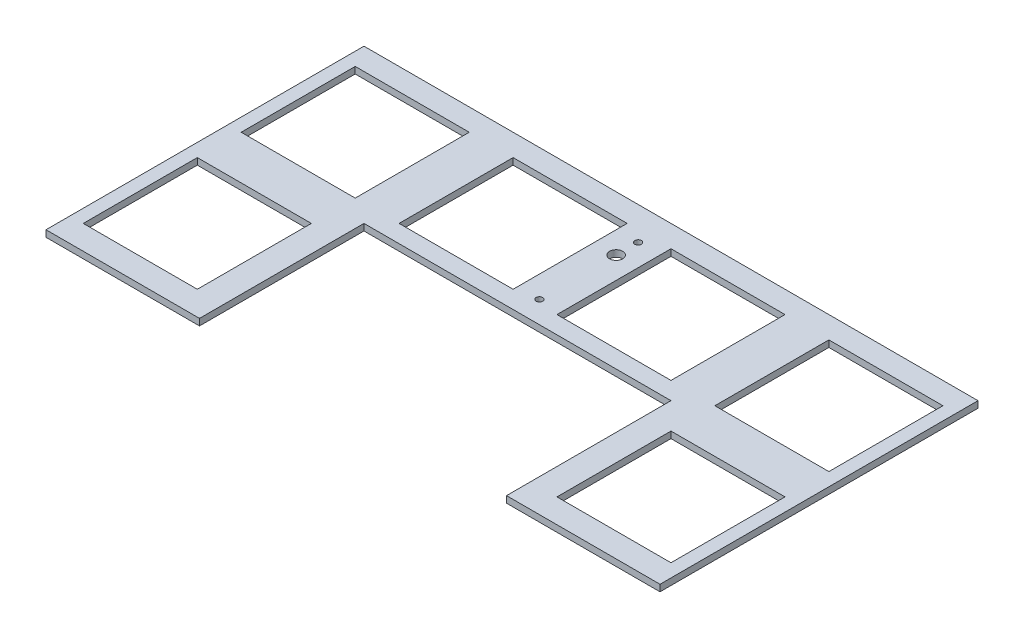
ISO-10303-21;
HEADER;
FILE_DESCRIPTION(('STEP AP214'),'2;1');
FILE_NAME('part.step','',(''),(''),'','','');
FILE_SCHEMA(('AUTOMOTIVE_DESIGN { 1 0 10303 214 1 1 1 1 }'));
ENDSEC;
DATA;
#1=APPLICATION_CONTEXT('core data for automotive mechanical design processes');
#2=APPLICATION_PROTOCOL_DEFINITION('international standard','automotive_design',2000,#1);
#3=PRODUCT_CONTEXT('',#1,'mechanical');
#4=PRODUCT('Part','Part','',(#3));
#5=PRODUCT_RELATED_PRODUCT_CATEGORY('part','',(#4));
#6=PRODUCT_DEFINITION_FORMATION('','',#4);
#7=PRODUCT_DEFINITION_CONTEXT('part definition',#1,'design');
#8=PRODUCT_DEFINITION('design','',#6,#7);
#9=PRODUCT_DEFINITION_SHAPE('','',#8);
#10=(LENGTH_UNIT() NAMED_UNIT(*) SI_UNIT(.MILLI.,.METRE.));
#11=(NAMED_UNIT(*) PLANE_ANGLE_UNIT() SI_UNIT($,.RADIAN.));
#12=(NAMED_UNIT(*) SI_UNIT($,.STERADIAN.) SOLID_ANGLE_UNIT());
#13=UNCERTAINTY_MEASURE_WITH_UNIT(LENGTH_MEASURE(1.E-05),#10,'distance_accuracy_value','');
#14=(GEOMETRIC_REPRESENTATION_CONTEXT(3) GLOBAL_UNCERTAINTY_ASSIGNED_CONTEXT((#13)) GLOBAL_UNIT_ASSIGNED_CONTEXT((#10,
#11,#12)) REPRESENTATION_CONTEXT('',''));
#15=CARTESIAN_POINT('',(0.,0.,0.));
#16=DIRECTION('',(0.,0.,1.));
#17=DIRECTION('',(1.,0.,0.));
#18=AXIS2_PLACEMENT_3D('',#15,#16,#17);
#19=CARTESIAN_POINT('',(0.,3.,0.));
#20=DIRECTION('',(0.,1.,0.));
#21=DIRECTION('',(0.,0.,1.));
#22=AXIS2_PLACEMENT_3D('',#19,#20,#21);
#23=PLANE('',#22);
#24=CARTESIAN_POINT('',(0.,3.,-35.));
#25=DIRECTION('',(0.,1.,0.));
#26=DIRECTION('',(0.,0.,1.));
#27=AXIS2_PLACEMENT_3D('',#24,#25,#26);
#28=CIRCLE('',#27,1.5);
#29=CARTESIAN_POINT('',(0.,3.,-33.5));
#30=VERTEX_POINT('',#29);
#31=EDGE_CURVE('E683',#30,#30,#28,.T.);
#32=ORIENTED_EDGE('',*,*,#31,.F.);
#33=EDGE_LOOP('',(#32));
#34=FACE_BOUND('',#33,.T.);
#35=DIRECTION('',(1.,0.,0.));
#36=VECTOR('',#35,1.);
#37=CARTESIAN_POINT('',(-134.,3.,39.));
#38=LINE('',#37,#36);
#39=CARTESIAN_POINT('',(-134.,3.,39.));
#40=VERTEX_POINT('',#39);
#41=CARTESIAN_POINT('',(-82.,3.,39.));
#42=VERTEX_POINT('',#41);
#43=EDGE_CURVE('E251',#40,#42,#38,.T.);
#44=ORIENTED_EDGE('',*,*,#43,.F.);
#45=DIRECTION('',(0.,0.,1.));
#46=VECTOR('',#45,1.);
#47=CARTESIAN_POINT('',(-134.,3.,-13.));
#48=LINE('',#47,#46);
#49=CARTESIAN_POINT('',(-134.,3.,-13.));
#50=VERTEX_POINT('',#49);
#51=EDGE_CURVE('E243',#50,#40,#48,.T.);
#52=ORIENTED_EDGE('',*,*,#51,.F.);
#53=DIRECTION('',(-1.,0.,0.));
#54=VECTOR('',#53,1.);
#55=CARTESIAN_POINT('',(-134.,3.,-13.));
#56=LINE('',#55,#54);
#57=CARTESIAN_POINT('',(-82.,3.,-13.));
#58=VERTEX_POINT('',#57);
#59=EDGE_CURVE('E266',#58,#50,#56,.T.);
#60=ORIENTED_EDGE('',*,*,#59,.F.);
#61=DIRECTION('',(0.,0.,-1.));
#62=VECTOR('',#61,1.);
#63=CARTESIAN_POINT('',(-82.,3.,-13.));
#64=LINE('',#63,#62);
#65=EDGE_CURVE('E264',#42,#58,#64,.T.);
#66=ORIENTED_EDGE('',*,*,#65,.F.);
#67=EDGE_LOOP('',(#44,#52,#60,#66));
#68=FACE_BOUND('',#67,.T.);
#69=DIRECTION('',(-1.,0.,0.));
#70=VECTOR('',#69,1.);
#71=CARTESIAN_POINT('',(-10.,3.,-85.));
#72=LINE('',#71,#70);
#73=CARTESIAN_POINT('',(-10.,3.,-85.));
#74=VERTEX_POINT('',#73);
#75=CARTESIAN_POINT('',(-62.,3.,-85.));
#76=VERTEX_POINT('',#75);
#77=EDGE_CURVE('E284',#74,#76,#72,.T.);
#78=ORIENTED_EDGE('',*,*,#77,.F.);
#79=DIRECTION('',(0.,0.,-1.));
#80=VECTOR('',#79,1.);
#81=CARTESIAN_POINT('',(-10.,3.,-33.));
#82=LINE('',#81,#80);
#83=CARTESIAN_POINT('',(-10.,3.,-33.));
#84=VERTEX_POINT('',#83);
#85=EDGE_CURVE('E282',#84,#74,#82,.T.);
#86=ORIENTED_EDGE('',*,*,#85,.F.);
#87=DIRECTION('',(1.,0.,0.));
#88=VECTOR('',#87,1.);
#89=CARTESIAN_POINT('',(-10.,3.,-33.));
#90=LINE('',#89,#88);
#91=CARTESIAN_POINT('',(-62.,3.,-33.));
#92=VERTEX_POINT('',#91);
#93=EDGE_CURVE('E290',#92,#84,#90,.T.);
#94=ORIENTED_EDGE('',*,*,#93,.F.);
#95=DIRECTION('',(0.,0.,1.));
#96=VECTOR('',#95,1.);
#97=CARTESIAN_POINT('',(-62.,3.,-33.));
#98=LINE('',#97,#96);
#99=EDGE_CURVE('E287',#76,#92,#98,.T.);
#100=ORIENTED_EDGE('',*,*,#99,.F.);
#101=EDGE_LOOP('',(#78,#86,#94,#100));
#102=FACE_BOUND('',#101,.T.);
#103=DIRECTION('',(1.,0.,0.));
#104=VECTOR('',#103,1.);
#105=CARTESIAN_POINT('',(82.,3.,39.));
#106=LINE('',#105,#104);
#107=CARTESIAN_POINT('',(82.,3.,39.));
#108=VERTEX_POINT('',#107);
#109=CARTESIAN_POINT('',(134.,3.,39.));
#110=VERTEX_POINT('',#109);
#111=EDGE_CURVE('E315',#108,#110,#106,.T.);
#112=ORIENTED_EDGE('',*,*,#111,.F.);
#113=DIRECTION('',(0.,0.,1.));
#114=VECTOR('',#113,1.);
#115=CARTESIAN_POINT('',(82.,3.,-13.));
#116=LINE('',#115,#114);
#117=CARTESIAN_POINT('',(82.,3.,-13.));
#118=VERTEX_POINT('',#117);
#119=EDGE_CURVE('E313',#118,#108,#116,.T.);
#120=ORIENTED_EDGE('',*,*,#119,.F.);
#121=DIRECTION('',(-1.,0.,0.));
#122=VECTOR('',#121,1.);
#123=CARTESIAN_POINT('',(82.,3.,-13.));
#124=LINE('',#123,#122);
#125=CARTESIAN_POINT('',(134.,3.,-13.));
#126=VERTEX_POINT('',#125);
#127=EDGE_CURVE('E321',#126,#118,#124,.T.);
#128=ORIENTED_EDGE('',*,*,#127,.F.);
#129=DIRECTION('',(0.,0.,-1.));
#130=VECTOR('',#129,1.);
#131=CARTESIAN_POINT('',(134.,3.,-13.));
#132=LINE('',#131,#130);
#133=EDGE_CURVE('E318',#110,#126,#132,.T.);
#134=ORIENTED_EDGE('',*,*,#133,.F.);
#135=EDGE_LOOP('',(#112,#120,#128,#134));
#136=FACE_BOUND('',#135,.T.);
#137=DIRECTION('',(1.,0.,0.));
#138=VECTOR('',#137,1.);
#139=CARTESIAN_POINT('',(82.,3.,-33.));
#140=LINE('',#139,#138);
#141=CARTESIAN_POINT('',(82.,3.,-33.));
#142=VERTEX_POINT('',#141);
#143=CARTESIAN_POINT('',(134.,3.,-33.));
#144=VERTEX_POINT('',#143);
#145=EDGE_CURVE('E346',#142,#144,#140,.T.);
#146=ORIENTED_EDGE('',*,*,#145,.F.);
#147=DIRECTION('',(0.,0.,1.));
#148=VECTOR('',#147,1.);
#149=CARTESIAN_POINT('',(82.,3.,-33.));
#150=LINE('',#149,#148);
#151=CARTESIAN_POINT('',(82.,3.,-85.));
#152=VERTEX_POINT('',#151);
#153=EDGE_CURVE('E344',#152,#142,#150,.T.);
#154=ORIENTED_EDGE('',*,*,#153,.F.);
#155=DIRECTION('',(-1.,0.,0.));
#156=VECTOR('',#155,1.);
#157=CARTESIAN_POINT('',(82.,3.,-85.));
#158=LINE('',#157,#156);
#159=CARTESIAN_POINT('',(134.,3.,-85.));
#160=VERTEX_POINT('',#159);
#161=EDGE_CURVE('E352',#160,#152,#158,.T.);
#162=ORIENTED_EDGE('',*,*,#161,.F.);
#163=DIRECTION('',(0.,0.,-1.));
#164=VECTOR('',#163,1.);
#165=CARTESIAN_POINT('',(134.,3.,-33.));
#166=LINE('',#165,#164);
#167=EDGE_CURVE('E349',#144,#160,#166,.T.);
#168=ORIENTED_EDGE('',*,*,#167,.F.);
#169=EDGE_LOOP('',(#146,#154,#162,#168));
#170=FACE_BOUND('',#169,.T.);
#171=DIRECTION('',(1.,0.,0.));
#172=VECTOR('',#171,1.);
#173=CARTESIAN_POINT('',(9.99999999999999,3.,-33.));
#174=LINE('',#173,#172);
#175=CARTESIAN_POINT('',(9.99999999999999,3.,-33.));
#176=VERTEX_POINT('',#175);
#177=CARTESIAN_POINT('',(62.,3.,-33.));
#178=VERTEX_POINT('',#177);
#179=EDGE_CURVE('E377',#176,#178,#174,.T.);
#180=ORIENTED_EDGE('',*,*,#179,.F.);
#181=DIRECTION('',(0.,0.,1.));
#182=VECTOR('',#181,1.);
#183=CARTESIAN_POINT('',(9.99999999999999,3.,-85.));
#184=LINE('',#183,#182);
#185=CARTESIAN_POINT('',(9.99999999999999,3.,-85.));
#186=VERTEX_POINT('',#185);
#187=EDGE_CURVE('E375',#186,#176,#184,.T.);
#188=ORIENTED_EDGE('',*,*,#187,.F.);
#189=DIRECTION('',(-1.,0.,0.));
#190=VECTOR('',#189,1.);
#191=CARTESIAN_POINT('',(9.99999999999999,3.,-85.));
#192=LINE('',#191,#190);
#193=CARTESIAN_POINT('',(62.,3.,-85.));
#194=VERTEX_POINT('',#193);
#195=EDGE_CURVE('E383',#194,#186,#192,.T.);
#196=ORIENTED_EDGE('',*,*,#195,.F.);
#197=DIRECTION('',(0.,0.,-1.));
#198=VECTOR('',#197,1.);
#199=CARTESIAN_POINT('',(62.,3.,-85.));
#200=LINE('',#199,#198);
#201=EDGE_CURVE('E380',#178,#194,#200,.T.);
#202=ORIENTED_EDGE('',*,*,#201,.F.);
#203=EDGE_LOOP('',(#180,#188,#196,#202));
#204=FACE_BOUND('',#203,.T.);
#205=DIRECTION('',(-1.,0.,0.));
#206=VECTOR('',#205,1.);
#207=CARTESIAN_POINT('',(-82.,3.,-85.));
#208=LINE('',#207,#206);
#209=CARTESIAN_POINT('',(-82.,3.,-85.));
#210=VERTEX_POINT('',#209);
#211=CARTESIAN_POINT('',(-134.,3.,-85.));
#212=VERTEX_POINT('',#211);
#213=EDGE_CURVE('E408',#210,#212,#208,.T.);
#214=ORIENTED_EDGE('',*,*,#213,.F.);
#215=DIRECTION('',(0.,0.,-1.));
#216=VECTOR('',#215,1.);
#217=CARTESIAN_POINT('',(-82.,3.,-33.));
#218=LINE('',#217,#216);
#219=CARTESIAN_POINT('',(-82.,3.,-33.));
#220=VERTEX_POINT('',#219);
#221=EDGE_CURVE('E406',#220,#210,#218,.T.);
#222=ORIENTED_EDGE('',*,*,#221,.F.);
#223=DIRECTION('',(1.,0.,0.));
#224=VECTOR('',#223,1.);
#225=CARTESIAN_POINT('',(-82.,3.,-33.));
#226=LINE('',#225,#224);
#227=CARTESIAN_POINT('',(-134.,3.,-33.));
#228=VERTEX_POINT('',#227);
#229=EDGE_CURVE('E414',#228,#220,#226,.T.);
#230=ORIENTED_EDGE('',*,*,#229,.F.);
#231=DIRECTION('',(0.,0.,1.));
#232=VECTOR('',#231,1.);
#233=CARTESIAN_POINT('',(-134.,3.,-33.));
#234=LINE('',#233,#232);
#235=EDGE_CURVE('E411',#212,#228,#234,.T.);
#236=ORIENTED_EDGE('',*,*,#235,.F.);
#237=EDGE_LOOP('',(#214,#222,#230,#236));
#238=FACE_BOUND('',#237,.T.);
#239=DIRECTION('',(1.,0.,0.));
#240=VECTOR('',#239,1.);
#241=CARTESIAN_POINT('',(70.,3.,50.));
#242=LINE('',#241,#240);
#243=CARTESIAN_POINT('',(70.,3.,50.));
#244=VERTEX_POINT('',#243);
#245=CARTESIAN_POINT('',(140.,3.,50.));
#246=VERTEX_POINT('',#245);
#247=EDGE_CURVE('E437',#244,#246,#242,.T.);
#248=ORIENTED_EDGE('',*,*,#247,.T.);
#249=DIRECTION('',(0.,0.,-1.));
#250=VECTOR('',#249,1.);
#251=CARTESIAN_POINT('',(140.,3.,50.));
#252=LINE('',#251,#250);
#253=CARTESIAN_POINT('',(140.,3.,-95.));
#254=VERTEX_POINT('',#253);
#255=EDGE_CURVE('E440',#246,#254,#252,.T.);
#256=ORIENTED_EDGE('',*,*,#255,.T.);
#257=DIRECTION('',(-1.,0.,0.));
#258=VECTOR('',#257,1.);
#259=CARTESIAN_POINT('',(-140.,3.,-95.));
#260=LINE('',#259,#258);
#261=CARTESIAN_POINT('',(-140.,3.,-95.));
#262=VERTEX_POINT('',#261);
#263=EDGE_CURVE('E443',#254,#262,#260,.T.);
#264=ORIENTED_EDGE('',*,*,#263,.T.);
#265=DIRECTION('',(0.,0.,1.));
#266=VECTOR('',#265,1.);
#267=CARTESIAN_POINT('',(-140.,3.,50.));
#268=LINE('',#267,#266);
#269=CARTESIAN_POINT('',(-140.,3.,50.));
#270=VERTEX_POINT('',#269);
#271=EDGE_CURVE('E445',#262,#270,#268,.T.);
#272=ORIENTED_EDGE('',*,*,#271,.T.);
#273=DIRECTION('',(1.,0.,0.));
#274=VECTOR('',#273,1.);
#275=CARTESIAN_POINT('',(-140.,3.,50.));
#276=LINE('',#275,#274);
#277=CARTESIAN_POINT('',(-70.,3.,50.));
#278=VERTEX_POINT('',#277);
#279=EDGE_CURVE('E447',#270,#278,#276,.T.);
#280=ORIENTED_EDGE('',*,*,#279,.T.);
#281=DIRECTION('',(0.,0.,-1.));
#282=VECTOR('',#281,1.);
#283=CARTESIAN_POINT('',(-70.,3.,50.));
#284=LINE('',#283,#282);
#285=CARTESIAN_POINT('',(-70.,3.,-25.));
#286=VERTEX_POINT('',#285);
#287=EDGE_CURVE('E449',#278,#286,#284,.T.);
#288=ORIENTED_EDGE('',*,*,#287,.T.);
#289=DIRECTION('',(1.,0.,0.));
#290=VECTOR('',#289,1.);
#291=CARTESIAN_POINT('',(-70.,3.,-25.));
#292=LINE('',#291,#290);
#293=CARTESIAN_POINT('',(70.,3.,-25.));
#294=VERTEX_POINT('',#293);
#295=EDGE_CURVE('E451',#286,#294,#292,.T.);
#296=ORIENTED_EDGE('',*,*,#295,.T.);
#297=DIRECTION('',(0.,0.,1.));
#298=VECTOR('',#297,1.);
#299=CARTESIAN_POINT('',(70.,3.,-25.));
#300=LINE('',#299,#298);
#301=EDGE_CURVE('E453',#294,#244,#300,.T.);
#302=ORIENTED_EDGE('',*,*,#301,.T.);
#303=EDGE_LOOP('',(#248,#256,#264,#272,#280,#288,#296,#302));
#304=FACE_BOUND('',#303,.T.);
#305=CARTESIAN_POINT('',(0.,3.,-80.));
#306=DIRECTION('',(0.,1.,0.));
#307=DIRECTION('',(0.,0.,1.));
#308=AXIS2_PLACEMENT_3D('',#305,#306,#307);
#309=CIRCLE('',#308,1.5);
#310=CARTESIAN_POINT('',(0.,3.,-78.5));
#311=VERTEX_POINT('',#310);
#312=EDGE_CURVE('E272',#311,#311,#309,.T.);
#313=ORIENTED_EDGE('',*,*,#312,.F.);
#314=EDGE_LOOP('',(#313));
#315=FACE_BOUND('',#314,.T.);
#316=CARTESIAN_POINT('',(0.,3.,-70.));
#317=DIRECTION('',(0.,1.,0.));
#318=DIRECTION('',(0.,0.,1.));
#319=AXIS2_PLACEMENT_3D('',#316,#317,#318);
#320=CIRCLE('',#319,3.);
#321=CARTESIAN_POINT('',(0.,3.,-67.));
#322=VERTEX_POINT('',#321);
#323=EDGE_CURVE('E674',#322,#322,#320,.T.);
#324=ORIENTED_EDGE('',*,*,#323,.F.);
#325=EDGE_LOOP('',(#324));
#326=FACE_BOUND('',#325,.T.);
#327=ADVANCED_FACE('F34',(#34,#68,#102,#136,#170,#204,#238,#304,#315,#326),#23,.T.);
#328=CARTESIAN_POINT('',(0.,0.,0.));
#329=DIRECTION('',(0.,1.,0.));
#330=DIRECTION('',(0.,0.,1.));
#331=AXIS2_PLACEMENT_3D('',#328,#329,#330);
#332=PLANE('',#331);
#333=DIRECTION('',(0.,0.,-1.));
#334=VECTOR('',#333,1.);
#335=CARTESIAN_POINT('',(-10.,0.,-33.));
#336=LINE('',#335,#334);
#337=CARTESIAN_POINT('',(-10.,0.,-33.));
#338=VERTEX_POINT('',#337);
#339=CARTESIAN_POINT('',(-10.,0.,-85.));
#340=VERTEX_POINT('',#339);
#341=EDGE_CURVE('E259',#338,#340,#336,.T.);
#342=ORIENTED_EDGE('',*,*,#341,.T.);
#343=DIRECTION('',(-1.,0.,0.));
#344=VECTOR('',#343,1.);
#345=CARTESIAN_POINT('',(-10.,0.,-85.));
#346=LINE('',#345,#344);
#347=CARTESIAN_POINT('',(-62.,0.,-85.));
#348=VERTEX_POINT('',#347);
#349=EDGE_CURVE('E295',#340,#348,#346,.T.);
#350=ORIENTED_EDGE('',*,*,#349,.T.);
#351=DIRECTION('',(0.,0.,1.));
#352=VECTOR('',#351,1.);
#353=CARTESIAN_POINT('',(-62.,0.,-33.));
#354=LINE('',#353,#352);
#355=CARTESIAN_POINT('',(-62.,0.,-33.));
#356=VERTEX_POINT('',#355);
#357=EDGE_CURVE('E298',#348,#356,#354,.T.);
#358=ORIENTED_EDGE('',*,*,#357,.T.);
#359=DIRECTION('',(1.,0.,0.));
#360=VECTOR('',#359,1.);
#361=CARTESIAN_POINT('',(-10.,0.,-33.));
#362=LINE('',#361,#360);
#363=EDGE_CURVE('E285',#356,#338,#362,.T.);
#364=ORIENTED_EDGE('',*,*,#363,.T.);
#365=EDGE_LOOP('',(#342,#350,#358,#364));
#366=FACE_BOUND('',#365,.T.);
#367=DIRECTION('',(0.,0.,1.));
#368=VECTOR('',#367,1.);
#369=CARTESIAN_POINT('',(82.,0.,-33.));
#370=LINE('',#369,#368);
#371=CARTESIAN_POINT('',(82.,0.,-85.));
#372=VERTEX_POINT('',#371);
#373=CARTESIAN_POINT('',(82.,0.,-33.));
#374=VERTEX_POINT('',#373);
#375=EDGE_CURVE('E343',#372,#374,#370,.T.);
#376=ORIENTED_EDGE('',*,*,#375,.T.);
#377=DIRECTION('',(1.,0.,0.));
#378=VECTOR('',#377,1.);
#379=CARTESIAN_POINT('',(82.,0.,-33.));
#380=LINE('',#379,#378);
#381=CARTESIAN_POINT('',(134.,0.,-33.));
#382=VERTEX_POINT('',#381);
#383=EDGE_CURVE('E357',#374,#382,#380,.T.);
#384=ORIENTED_EDGE('',*,*,#383,.T.);
#385=DIRECTION('',(0.,0.,-1.));
#386=VECTOR('',#385,1.);
#387=CARTESIAN_POINT('',(134.,0.,-33.));
#388=LINE('',#387,#386);
#389=CARTESIAN_POINT('',(134.,0.,-85.));
#390=VERTEX_POINT('',#389);
#391=EDGE_CURVE('E360',#382,#390,#388,.T.);
#392=ORIENTED_EDGE('',*,*,#391,.T.);
#393=DIRECTION('',(-1.,0.,0.));
#394=VECTOR('',#393,1.);
#395=CARTESIAN_POINT('',(82.,0.,-85.));
#396=LINE('',#395,#394);
#397=EDGE_CURVE('E347',#390,#372,#396,.T.);
#398=ORIENTED_EDGE('',*,*,#397,.T.);
#399=EDGE_LOOP('',(#376,#384,#392,#398));
#400=FACE_BOUND('',#399,.T.);
#401=DIRECTION('',(0.,0.,-1.));
#402=VECTOR('',#401,1.);
#403=CARTESIAN_POINT('',(-82.,0.,-33.));
#404=LINE('',#403,#402);
#405=CARTESIAN_POINT('',(-82.,0.,-33.));
#406=VERTEX_POINT('',#405);
#407=CARTESIAN_POINT('',(-82.,0.,-85.));
#408=VERTEX_POINT('',#407);
#409=EDGE_CURVE('E405',#406,#408,#404,.T.);
#410=ORIENTED_EDGE('',*,*,#409,.T.);
#411=DIRECTION('',(-1.,0.,0.));
#412=VECTOR('',#411,1.);
#413=CARTESIAN_POINT('',(-82.,0.,-85.));
#414=LINE('',#413,#412);
#415=CARTESIAN_POINT('',(-134.,0.,-85.));
#416=VERTEX_POINT('',#415);
#417=EDGE_CURVE('E419',#408,#416,#414,.T.);
#418=ORIENTED_EDGE('',*,*,#417,.T.);
#419=DIRECTION('',(0.,0.,1.));
#420=VECTOR('',#419,1.);
#421=CARTESIAN_POINT('',(-134.,0.,-33.));
#422=LINE('',#421,#420);
#423=CARTESIAN_POINT('',(-134.,0.,-33.));
#424=VERTEX_POINT('',#423);
#425=EDGE_CURVE('E422',#416,#424,#422,.T.);
#426=ORIENTED_EDGE('',*,*,#425,.T.);
#427=DIRECTION('',(1.,0.,0.));
#428=VECTOR('',#427,1.);
#429=CARTESIAN_POINT('',(-82.,0.,-33.));
#430=LINE('',#429,#428);
#431=EDGE_CURVE('E409',#424,#406,#430,.T.);
#432=ORIENTED_EDGE('',*,*,#431,.T.);
#433=EDGE_LOOP('',(#410,#418,#426,#432));
#434=FACE_BOUND('',#433,.T.);
#435=DIRECTION('',(1.,0.,0.));
#436=VECTOR('',#435,1.);
#437=CARTESIAN_POINT('',(70.,0.,50.));
#438=LINE('',#437,#436);
#439=CARTESIAN_POINT('',(70.,0.,50.));
#440=VERTEX_POINT('',#439);
#441=CARTESIAN_POINT('',(140.,0.,50.));
#442=VERTEX_POINT('',#441);
#443=EDGE_CURVE('E436',#440,#442,#438,.T.);
#444=ORIENTED_EDGE('',*,*,#443,.F.);
#445=DIRECTION('',(0.,0.,1.));
#446=VECTOR('',#445,1.);
#447=CARTESIAN_POINT('',(70.,0.,-25.));
#448=LINE('',#447,#446);
#449=CARTESIAN_POINT('',(70.,0.,-25.));
#450=VERTEX_POINT('',#449);
#451=EDGE_CURVE('E441',#450,#440,#448,.T.);
#452=ORIENTED_EDGE('',*,*,#451,.F.);
#453=DIRECTION('',(1.,0.,0.));
#454=VECTOR('',#453,1.);
#455=CARTESIAN_POINT('',(-70.,0.,-25.));
#456=LINE('',#455,#454);
#457=CARTESIAN_POINT('',(-70.,0.,-25.));
#458=VERTEX_POINT('',#457);
#459=EDGE_CURVE('E468',#458,#450,#456,.T.);
#460=ORIENTED_EDGE('',*,*,#459,.F.);
#461=DIRECTION('',(0.,0.,-1.));
#462=VECTOR('',#461,1.);
#463=CARTESIAN_POINT('',(-70.,0.,50.));
#464=LINE('',#463,#462);
#465=CARTESIAN_POINT('',(-70.,0.,50.));
#466=VERTEX_POINT('',#465);
#467=EDGE_CURVE('E466',#466,#458,#464,.T.);
#468=ORIENTED_EDGE('',*,*,#467,.F.);
#469=DIRECTION('',(1.,0.,0.));
#470=VECTOR('',#469,1.);
#471=CARTESIAN_POINT('',(-140.,0.,50.));
#472=LINE('',#471,#470);
#473=CARTESIAN_POINT('',(-140.,0.,50.));
#474=VERTEX_POINT('',#473);
#475=EDGE_CURVE('E464',#474,#466,#472,.T.);
#476=ORIENTED_EDGE('',*,*,#475,.F.);
#477=DIRECTION('',(0.,0.,1.));
#478=VECTOR('',#477,1.);
#479=CARTESIAN_POINT('',(-140.,0.,50.));
#480=LINE('',#479,#478);
#481=CARTESIAN_POINT('',(-140.,0.,-95.));
#482=VERTEX_POINT('',#481);
#483=EDGE_CURVE('E462',#482,#474,#480,.T.);
#484=ORIENTED_EDGE('',*,*,#483,.F.);
#485=DIRECTION('',(-1.,0.,0.));
#486=VECTOR('',#485,1.);
#487=CARTESIAN_POINT('',(-140.,0.,-95.));
#488=LINE('',#487,#486);
#489=CARTESIAN_POINT('',(140.,0.,-95.));
#490=VERTEX_POINT('',#489);
#491=EDGE_CURVE('E460',#490,#482,#488,.T.);
#492=ORIENTED_EDGE('',*,*,#491,.F.);
#493=DIRECTION('',(0.,0.,-1.));
#494=VECTOR('',#493,1.);
#495=CARTESIAN_POINT('',(140.,0.,50.));
#496=LINE('',#495,#494);
#497=EDGE_CURVE('E458',#442,#490,#496,.T.);
#498=ORIENTED_EDGE('',*,*,#497,.F.);
#499=EDGE_LOOP('',(#444,#452,#460,#468,#476,#484,#492,#498));
#500=FACE_BOUND('',#499,.T.);
#501=DIRECTION('',(0.,0.,1.));
#502=VECTOR('',#501,1.);
#503=CARTESIAN_POINT('',(9.99999999999999,0.,-85.));
#504=LINE('',#503,#502);
#505=CARTESIAN_POINT('',(9.99999999999999,0.,-85.));
#506=VERTEX_POINT('',#505);
#507=CARTESIAN_POINT('',(9.99999999999999,0.,-33.));
#508=VERTEX_POINT('',#507);
#509=EDGE_CURVE('E374',#506,#508,#504,.T.);
#510=ORIENTED_EDGE('',*,*,#509,.T.);
#511=DIRECTION('',(1.,0.,0.));
#512=VECTOR('',#511,1.);
#513=CARTESIAN_POINT('',(9.99999999999999,0.,-33.));
#514=LINE('',#513,#512);
#515=CARTESIAN_POINT('',(62.,0.,-33.));
#516=VERTEX_POINT('',#515);
#517=EDGE_CURVE('E388',#508,#516,#514,.T.);
#518=ORIENTED_EDGE('',*,*,#517,.T.);
#519=DIRECTION('',(0.,0.,-1.));
#520=VECTOR('',#519,1.);
#521=CARTESIAN_POINT('',(62.,0.,-85.));
#522=LINE('',#521,#520);
#523=CARTESIAN_POINT('',(62.,0.,-85.));
#524=VERTEX_POINT('',#523);
#525=EDGE_CURVE('E391',#516,#524,#522,.T.);
#526=ORIENTED_EDGE('',*,*,#525,.T.);
#527=DIRECTION('',(-1.,0.,0.));
#528=VECTOR('',#527,1.);
#529=CARTESIAN_POINT('',(9.99999999999999,0.,-85.));
#530=LINE('',#529,#528);
#531=EDGE_CURVE('E378',#524,#506,#530,.T.);
#532=ORIENTED_EDGE('',*,*,#531,.T.);
#533=EDGE_LOOP('',(#510,#518,#526,#532));
#534=FACE_BOUND('',#533,.T.);
#535=DIRECTION('',(0.,0.,1.));
#536=VECTOR('',#535,1.);
#537=CARTESIAN_POINT('',(82.,0.,-13.));
#538=LINE('',#537,#536);
#539=CARTESIAN_POINT('',(82.,0.,-13.));
#540=VERTEX_POINT('',#539);
#541=CARTESIAN_POINT('',(82.,0.,39.));
#542=VERTEX_POINT('',#541);
#543=EDGE_CURVE('E312',#540,#542,#538,.T.);
#544=ORIENTED_EDGE('',*,*,#543,.T.);
#545=DIRECTION('',(1.,0.,0.));
#546=VECTOR('',#545,1.);
#547=CARTESIAN_POINT('',(82.,0.,39.));
#548=LINE('',#547,#546);
#549=CARTESIAN_POINT('',(134.,0.,39.));
#550=VERTEX_POINT('',#549);
#551=EDGE_CURVE('E326',#542,#550,#548,.T.);
#552=ORIENTED_EDGE('',*,*,#551,.T.);
#553=DIRECTION('',(0.,0.,-1.));
#554=VECTOR('',#553,1.);
#555=CARTESIAN_POINT('',(134.,0.,-13.));
#556=LINE('',#555,#554);
#557=CARTESIAN_POINT('',(134.,0.,-13.));
#558=VERTEX_POINT('',#557);
#559=EDGE_CURVE('E329',#550,#558,#556,.T.);
#560=ORIENTED_EDGE('',*,*,#559,.T.);
#561=DIRECTION('',(-1.,0.,0.));
#562=VECTOR('',#561,1.);
#563=CARTESIAN_POINT('',(82.,0.,-13.));
#564=LINE('',#563,#562);
#565=EDGE_CURVE('E316',#558,#540,#564,.T.);
#566=ORIENTED_EDGE('',*,*,#565,.T.);
#567=EDGE_LOOP('',(#544,#552,#560,#566));
#568=FACE_BOUND('',#567,.T.);
#569=DIRECTION('',(0.,0.,1.));
#570=VECTOR('',#569,1.);
#571=CARTESIAN_POINT('',(-134.,0.,-13.));
#572=LINE('',#571,#570);
#573=CARTESIAN_POINT('',(-134.,0.,-13.));
#574=VERTEX_POINT('',#573);
#575=CARTESIAN_POINT('',(-134.,0.,39.));
#576=VERTEX_POINT('',#575);
#577=EDGE_CURVE('E57',#574,#576,#572,.T.);
#578=ORIENTED_EDGE('',*,*,#577,.T.);
#579=DIRECTION('',(1.,0.,0.));
#580=VECTOR('',#579,1.);
#581=CARTESIAN_POINT('',(-134.,0.,39.));
#582=LINE('',#581,#580);
#583=CARTESIAN_POINT('',(-82.,0.,39.));
#584=VERTEX_POINT('',#583);
#585=EDGE_CURVE('E258',#576,#584,#582,.T.);
#586=ORIENTED_EDGE('',*,*,#585,.T.);
#587=DIRECTION('',(0.,0.,-1.));
#588=VECTOR('',#587,1.);
#589=CARTESIAN_POINT('',(-82.,0.,-13.));
#590=LINE('',#589,#588);
#591=CARTESIAN_POINT('',(-82.,0.,-13.));
#592=VERTEX_POINT('',#591);
#593=EDGE_CURVE('E274',#584,#592,#590,.T.);
#594=ORIENTED_EDGE('',*,*,#593,.T.);
#595=DIRECTION('',(-1.,0.,0.));
#596=VECTOR('',#595,1.);
#597=CARTESIAN_POINT('',(-134.,0.,-13.));
#598=LINE('',#597,#596);
#599=EDGE_CURVE('E252',#592,#574,#598,.T.);
#600=ORIENTED_EDGE('',*,*,#599,.T.);
#601=EDGE_LOOP('',(#578,#586,#594,#600));
#602=FACE_BOUND('',#601,.T.);
#603=CARTESIAN_POINT('',(0.,0.,-80.));
#604=DIRECTION('',(0.,1.,0.));
#605=DIRECTION('',(0.,0.,1.));
#606=AXIS2_PLACEMENT_3D('',#603,#604,#605);
#607=CIRCLE('',#606,1.5);
#608=CARTESIAN_POINT('',(0.,0.,-78.5));
#609=VERTEX_POINT('',#608);
#610=EDGE_CURVE('E686',#609,#609,#607,.T.);
#611=ORIENTED_EDGE('',*,*,#610,.T.);
#612=EDGE_LOOP('',(#611));
#613=FACE_BOUND('',#612,.T.);
#614=CARTESIAN_POINT('',(0.,0.,-35.));
#615=DIRECTION('',(0.,1.,0.));
#616=DIRECTION('',(0.,0.,1.));
#617=AXIS2_PLACEMENT_3D('',#614,#615,#616);
#618=CIRCLE('',#617,1.5);
#619=CARTESIAN_POINT('',(0.,0.,-33.5));
#620=VERTEX_POINT('',#619);
#621=EDGE_CURVE('E680',#620,#620,#618,.T.);
#622=ORIENTED_EDGE('',*,*,#621,.T.);
#623=EDGE_LOOP('',(#622));
#624=FACE_BOUND('',#623,.T.);
#625=CARTESIAN_POINT('',(0.,0.,-70.));
#626=DIRECTION('',(0.,1.,0.));
#627=DIRECTION('',(0.,0.,1.));
#628=AXIS2_PLACEMENT_3D('',#625,#626,#627);
#629=CIRCLE('',#628,3.);
#630=CARTESIAN_POINT('',(0.,0.,-67.));
#631=VERTEX_POINT('',#630);
#632=EDGE_CURVE('E677',#631,#631,#629,.T.);
#633=ORIENTED_EDGE('',*,*,#632,.T.);
#634=EDGE_LOOP('',(#633));
#635=FACE_BOUND('',#634,.T.);
#636=ADVANCED_FACE('F498',(#366,#400,#434,#500,#534,#568,#602,#613,#624,#635),#332,.F.);
#637=CARTESIAN_POINT('',(70.,3.,50.));
#638=DIRECTION('',(0.,0.,-1.));
#639=DIRECTION('',(-1.,0.,0.));
#640=AXIS2_PLACEMENT_3D('',#637,#638,#639);
#641=PLANE('',#640);
#642=ORIENTED_EDGE('',*,*,#443,.T.);
#643=DIRECTION('',(0.,-1.,0.));
#644=VECTOR('',#643,1.);
#645=CARTESIAN_POINT('',(140.,3.,50.));
#646=LINE('',#645,#644);
#647=EDGE_CURVE('E11',#246,#442,#646,.T.);
#648=ORIENTED_EDGE('',*,*,#647,.F.);
#649=ORIENTED_EDGE('',*,*,#247,.F.);
#650=DIRECTION('',(0.,-1.,0.));
#651=VECTOR('',#650,1.);
#652=CARTESIAN_POINT('',(70.,3.,50.));
#653=LINE('',#652,#651);
#654=EDGE_CURVE('E455',#244,#440,#653,.T.);
#655=ORIENTED_EDGE('',*,*,#654,.T.);
#656=EDGE_LOOP('',(#642,#648,#649,#655));
#657=FACE_BOUND('',#656,.T.);
#658=ADVANCED_FACE('F36',(#657),#641,.F.);
#659=CARTESIAN_POINT('',(140.,3.,50.));
#660=DIRECTION('',(-1.,0.,0.));
#661=DIRECTION('',(0.,0.,1.));
#662=AXIS2_PLACEMENT_3D('',#659,#660,#661);
#663=PLANE('',#662);
#664=ORIENTED_EDGE('',*,*,#497,.T.);
#665=DIRECTION('',(0.,-1.,0.));
#666=VECTOR('',#665,1.);
#667=CARTESIAN_POINT('',(140.,3.,-95.));
#668=LINE('',#667,#666);
#669=EDGE_CURVE('E42',#254,#490,#668,.T.);
#670=ORIENTED_EDGE('',*,*,#669,.F.);
#671=ORIENTED_EDGE('',*,*,#255,.F.);
#672=ORIENTED_EDGE('',*,*,#647,.T.);
#673=EDGE_LOOP('',(#664,#670,#671,#672));
#674=FACE_BOUND('',#673,.T.);
#675=ADVANCED_FACE('F516',(#674),#663,.F.);
#676=CARTESIAN_POINT('',(-140.,3.,-95.));
#677=DIRECTION('',(0.,0.,1.));
#678=DIRECTION('',(1.,0.,0.));
#679=AXIS2_PLACEMENT_3D('',#676,#677,#678);
#680=PLANE('',#679);
#681=ORIENTED_EDGE('',*,*,#491,.T.);
#682=DIRECTION('',(0.,-1.,0.));
#683=VECTOR('',#682,1.);
#684=CARTESIAN_POINT('',(-140.,3.,-95.));
#685=LINE('',#684,#683);
#686=EDGE_CURVE('E485',#262,#482,#685,.T.);
#687=ORIENTED_EDGE('',*,*,#686,.F.);
#688=ORIENTED_EDGE('',*,*,#263,.F.);
#689=ORIENTED_EDGE('',*,*,#669,.T.);
#690=EDGE_LOOP('',(#681,#687,#688,#689));
#691=FACE_BOUND('',#690,.T.);
#692=ADVANCED_FACE('F492',(#691),#680,.F.);
#693=CARTESIAN_POINT('',(-140.,3.,50.));
#694=DIRECTION('',(1.,0.,0.));
#695=DIRECTION('',(0.,0.,-1.));
#696=AXIS2_PLACEMENT_3D('',#693,#694,#695);
#697=PLANE('',#696);
#698=ORIENTED_EDGE('',*,*,#483,.T.);
#699=DIRECTION('',(0.,-1.,0.));
#700=VECTOR('',#699,1.);
#701=CARTESIAN_POINT('',(-140.,3.,50.));
#702=LINE('',#701,#700);
#703=EDGE_CURVE('E482',#270,#474,#702,.T.);
#704=ORIENTED_EDGE('',*,*,#703,.F.);
#705=ORIENTED_EDGE('',*,*,#271,.F.);
#706=ORIENTED_EDGE('',*,*,#686,.T.);
#707=EDGE_LOOP('',(#698,#704,#705,#706));
#708=FACE_BOUND('',#707,.T.);
#709=ADVANCED_FACE('F504',(#708),#697,.F.);
#710=CARTESIAN_POINT('',(-140.,3.,50.));
#711=DIRECTION('',(0.,0.,-1.));
#712=DIRECTION('',(-1.,0.,0.));
#713=AXIS2_PLACEMENT_3D('',#710,#711,#712);
#714=PLANE('',#713);
#715=ORIENTED_EDGE('',*,*,#475,.T.);
#716=DIRECTION('',(0.,-1.,0.));
#717=VECTOR('',#716,1.);
#718=CARTESIAN_POINT('',(-70.,3.,50.));
#719=LINE('',#718,#717);
#720=EDGE_CURVE('E479',#278,#466,#719,.T.);
#721=ORIENTED_EDGE('',*,*,#720,.F.);
#722=ORIENTED_EDGE('',*,*,#279,.F.);
#723=ORIENTED_EDGE('',*,*,#703,.T.);
#724=EDGE_LOOP('',(#715,#721,#722,#723));
#725=FACE_BOUND('',#724,.T.);
#726=ADVANCED_FACE('F508',(#725),#714,.F.);
#727=CARTESIAN_POINT('',(-70.,3.,50.));
#728=DIRECTION('',(-1.,0.,0.));
#729=DIRECTION('',(0.,0.,1.));
#730=AXIS2_PLACEMENT_3D('',#727,#728,#729);
#731=PLANE('',#730);
#732=ORIENTED_EDGE('',*,*,#467,.T.);
#733=DIRECTION('',(0.,-1.,0.));
#734=VECTOR('',#733,1.);
#735=CARTESIAN_POINT('',(-70.,3.,-25.));
#736=LINE('',#735,#734);
#737=EDGE_CURVE('E476',#286,#458,#736,.T.);
#738=ORIENTED_EDGE('',*,*,#737,.F.);
#739=ORIENTED_EDGE('',*,*,#287,.F.);
#740=ORIENTED_EDGE('',*,*,#720,.T.);
#741=EDGE_LOOP('',(#732,#738,#739,#740));
#742=FACE_BOUND('',#741,.T.);
#743=ADVANCED_FACE('F529',(#742),#731,.F.);
#744=CARTESIAN_POINT('',(-70.,3.,-25.));
#745=DIRECTION('',(0.,0.,-1.));
#746=DIRECTION('',(-1.,0.,0.));
#747=AXIS2_PLACEMENT_3D('',#744,#745,#746);
#748=PLANE('',#747);
#749=ORIENTED_EDGE('',*,*,#459,.T.);
#750=DIRECTION('',(0.,-1.,0.));
#751=VECTOR('',#750,1.);
#752=CARTESIAN_POINT('',(70.,3.,-25.));
#753=LINE('',#752,#751);
#754=EDGE_CURVE('E473',#294,#450,#753,.T.);
#755=ORIENTED_EDGE('',*,*,#754,.F.);
#756=ORIENTED_EDGE('',*,*,#295,.F.);
#757=ORIENTED_EDGE('',*,*,#737,.T.);
#758=EDGE_LOOP('',(#749,#755,#756,#757));
#759=FACE_BOUND('',#758,.T.);
#760=ADVANCED_FACE('F527',(#759),#748,.F.);
#761=CARTESIAN_POINT('',(70.,3.,-25.));
#762=DIRECTION('',(1.,0.,0.));
#763=DIRECTION('',(0.,0.,-1.));
#764=AXIS2_PLACEMENT_3D('',#761,#762,#763);
#765=PLANE('',#764);
#766=ORIENTED_EDGE('',*,*,#451,.T.);
#767=ORIENTED_EDGE('',*,*,#654,.F.);
#768=ORIENTED_EDGE('',*,*,#301,.F.);
#769=ORIENTED_EDGE('',*,*,#754,.T.);
#770=EDGE_LOOP('',(#766,#767,#768,#769));
#771=FACE_BOUND('',#770,.T.);
#772=ADVANCED_FACE('F522',(#771),#765,.F.);
#773=CARTESIAN_POINT('',(-82.,3.,-33.));
#774=DIRECTION('',(-1.,0.,0.));
#775=DIRECTION('',(0.,0.,1.));
#776=AXIS2_PLACEMENT_3D('',#773,#774,#775);
#777=PLANE('',#776);
#778=ORIENTED_EDGE('',*,*,#409,.F.);
#779=DIRECTION('',(0.,-1.,0.));
#780=VECTOR('',#779,1.);
#781=CARTESIAN_POINT('',(-82.,3.,-33.));
#782=LINE('',#781,#780);
#783=EDGE_CURVE('E416',#220,#406,#782,.T.);
#784=ORIENTED_EDGE('',*,*,#783,.F.);
#785=ORIENTED_EDGE('',*,*,#221,.T.);
#786=DIRECTION('',(0.,-1.,0.));
#787=VECTOR('',#786,1.);
#788=CARTESIAN_POINT('',(-82.,3.,-85.));
#789=LINE('',#788,#787);
#790=EDGE_CURVE('E433',#210,#408,#789,.T.);
#791=ORIENTED_EDGE('',*,*,#790,.T.);
#792=EDGE_LOOP('',(#778,#784,#785,#791));
#793=FACE_BOUND('',#792,.T.);
#794=ADVANCED_FACE('F548',(#793),#777,.T.);
#795=CARTESIAN_POINT('',(-82.,3.,-85.));
#796=DIRECTION('',(0.,0.,1.));
#797=DIRECTION('',(1.,0.,0.));
#798=AXIS2_PLACEMENT_3D('',#795,#796,#797);
#799=PLANE('',#798);
#800=ORIENTED_EDGE('',*,*,#417,.F.);
#801=ORIENTED_EDGE('',*,*,#790,.F.);
#802=ORIENTED_EDGE('',*,*,#213,.T.);
#803=DIRECTION('',(0.,-1.,0.));
#804=VECTOR('',#803,1.);
#805=CARTESIAN_POINT('',(-134.,3.,-85.));
#806=LINE('',#805,#804);
#807=EDGE_CURVE('E431',#212,#416,#806,.T.);
#808=ORIENTED_EDGE('',*,*,#807,.T.);
#809=EDGE_LOOP('',(#800,#801,#802,#808));
#810=FACE_BOUND('',#809,.T.);
#811=ADVANCED_FACE('F555',(#810),#799,.T.);
#812=CARTESIAN_POINT('',(-134.,3.,-33.));
#813=DIRECTION('',(1.,0.,0.));
#814=DIRECTION('',(0.,0.,-1.));
#815=AXIS2_PLACEMENT_3D('',#812,#813,#814);
#816=PLANE('',#815);
#817=ORIENTED_EDGE('',*,*,#425,.F.);
#818=ORIENTED_EDGE('',*,*,#807,.F.);
#819=ORIENTED_EDGE('',*,*,#235,.T.);
#820=DIRECTION('',(0.,-1.,0.));
#821=VECTOR('',#820,1.);
#822=CARTESIAN_POINT('',(-134.,3.,-33.));
#823=LINE('',#822,#821);
#824=EDGE_CURVE('E429',#228,#424,#823,.T.);
#825=ORIENTED_EDGE('',*,*,#824,.T.);
#826=EDGE_LOOP('',(#817,#818,#819,#825));
#827=FACE_BOUND('',#826,.T.);
#828=ADVANCED_FACE('F560',(#827),#816,.T.);
#829=CARTESIAN_POINT('',(-82.,3.,-33.));
#830=DIRECTION('',(0.,0.,-1.));
#831=DIRECTION('',(-1.,0.,0.));
#832=AXIS2_PLACEMENT_3D('',#829,#830,#831);
#833=PLANE('',#832);
#834=ORIENTED_EDGE('',*,*,#431,.F.);
#835=ORIENTED_EDGE('',*,*,#824,.F.);
#836=ORIENTED_EDGE('',*,*,#229,.T.);
#837=ORIENTED_EDGE('',*,*,#783,.T.);
#838=EDGE_LOOP('',(#834,#835,#836,#837));
#839=FACE_BOUND('',#838,.T.);
#840=ADVANCED_FACE('F568',(#839),#833,.T.);
#841=CARTESIAN_POINT('',(9.99999999999999,3.,-85.));
#842=DIRECTION('',(1.,0.,0.));
#843=DIRECTION('',(0.,0.,-1.));
#844=AXIS2_PLACEMENT_3D('',#841,#842,#843);
#845=PLANE('',#844);
#846=ORIENTED_EDGE('',*,*,#509,.F.);
#847=DIRECTION('',(0.,-1.,0.));
#848=VECTOR('',#847,1.);
#849=CARTESIAN_POINT('',(9.99999999999999,3.,-85.));
#850=LINE('',#849,#848);
#851=EDGE_CURVE('E385',#186,#506,#850,.T.);
#852=ORIENTED_EDGE('',*,*,#851,.F.);
#853=ORIENTED_EDGE('',*,*,#187,.T.);
#854=DIRECTION('',(0.,-1.,0.));
#855=VECTOR('',#854,1.);
#856=CARTESIAN_POINT('',(9.99999999999999,3.,-33.));
#857=LINE('',#856,#855);
#858=EDGE_CURVE('E402',#176,#508,#857,.T.);
#859=ORIENTED_EDGE('',*,*,#858,.T.);
#860=EDGE_LOOP('',(#846,#852,#853,#859));
#861=FACE_BOUND('',#860,.T.);
#862=ADVANCED_FACE('F581',(#861),#845,.T.);
#863=CARTESIAN_POINT('',(9.99999999999999,3.,-33.));
#864=DIRECTION('',(0.,0.,-1.));
#865=DIRECTION('',(-1.,0.,0.));
#866=AXIS2_PLACEMENT_3D('',#863,#864,#865);
#867=PLANE('',#866);
#868=ORIENTED_EDGE('',*,*,#517,.F.);
#869=ORIENTED_EDGE('',*,*,#858,.F.);
#870=ORIENTED_EDGE('',*,*,#179,.T.);
#871=DIRECTION('',(0.,-1.,0.));
#872=VECTOR('',#871,1.);
#873=CARTESIAN_POINT('',(62.,3.,-33.));
#874=LINE('',#873,#872);
#875=EDGE_CURVE('E400',#178,#516,#874,.T.);
#876=ORIENTED_EDGE('',*,*,#875,.T.);
#877=EDGE_LOOP('',(#868,#869,#870,#876));
#878=FACE_BOUND('',#877,.T.);
#879=ADVANCED_FACE('F586',(#878),#867,.T.);
#880=CARTESIAN_POINT('',(62.,3.,-85.));
#881=DIRECTION('',(-1.,0.,0.));
#882=DIRECTION('',(0.,0.,1.));
#883=AXIS2_PLACEMENT_3D('',#880,#881,#882);
#884=PLANE('',#883);
#885=ORIENTED_EDGE('',*,*,#525,.F.);
#886=ORIENTED_EDGE('',*,*,#875,.F.);
#887=ORIENTED_EDGE('',*,*,#201,.T.);
#888=DIRECTION('',(0.,-1.,0.));
#889=VECTOR('',#888,1.);
#890=CARTESIAN_POINT('',(62.,3.,-85.));
#891=LINE('',#890,#889);
#892=EDGE_CURVE('E398',#194,#524,#891,.T.);
#893=ORIENTED_EDGE('',*,*,#892,.T.);
#894=EDGE_LOOP('',(#885,#886,#887,#893));
#895=FACE_BOUND('',#894,.T.);
#896=ADVANCED_FACE('F590',(#895),#884,.T.);
#897=CARTESIAN_POINT('',(9.99999999999999,3.,-85.));
#898=DIRECTION('',(0.,0.,1.));
#899=DIRECTION('',(1.,0.,0.));
#900=AXIS2_PLACEMENT_3D('',#897,#898,#899);
#901=PLANE('',#900);
#902=ORIENTED_EDGE('',*,*,#531,.F.);
#903=ORIENTED_EDGE('',*,*,#892,.F.);
#904=ORIENTED_EDGE('',*,*,#195,.T.);
#905=ORIENTED_EDGE('',*,*,#851,.T.);
#906=EDGE_LOOP('',(#902,#903,#904,#905));
#907=FACE_BOUND('',#906,.T.);
#908=ADVANCED_FACE('F594',(#907),#901,.T.);
#909=CARTESIAN_POINT('',(82.,3.,-33.));
#910=DIRECTION('',(1.,0.,0.));
#911=DIRECTION('',(0.,0.,-1.));
#912=AXIS2_PLACEMENT_3D('',#909,#910,#911);
#913=PLANE('',#912);
#914=ORIENTED_EDGE('',*,*,#375,.F.);
#915=DIRECTION('',(0.,-1.,0.));
#916=VECTOR('',#915,1.);
#917=CARTESIAN_POINT('',(82.,3.,-85.));
#918=LINE('',#917,#916);
#919=EDGE_CURVE('E354',#152,#372,#918,.T.);
#920=ORIENTED_EDGE('',*,*,#919,.F.);
#921=ORIENTED_EDGE('',*,*,#153,.T.);
#922=DIRECTION('',(0.,-1.,0.));
#923=VECTOR('',#922,1.);
#924=CARTESIAN_POINT('',(82.,3.,-33.));
#925=LINE('',#924,#923);
#926=EDGE_CURVE('E371',#142,#374,#925,.T.);
#927=ORIENTED_EDGE('',*,*,#926,.T.);
#928=EDGE_LOOP('',(#914,#920,#921,#927));
#929=FACE_BOUND('',#928,.T.);
#930=ADVANCED_FACE('F598',(#929),#913,.T.);
#931=CARTESIAN_POINT('',(82.,3.,-33.));
#932=DIRECTION('',(0.,0.,-1.));
#933=DIRECTION('',(-1.,0.,0.));
#934=AXIS2_PLACEMENT_3D('',#931,#932,#933);
#935=PLANE('',#934);
#936=ORIENTED_EDGE('',*,*,#383,.F.);
#937=ORIENTED_EDGE('',*,*,#926,.F.);
#938=ORIENTED_EDGE('',*,*,#145,.T.);
#939=DIRECTION('',(0.,-1.,0.));
#940=VECTOR('',#939,1.);
#941=CARTESIAN_POINT('',(134.,3.,-33.));
#942=LINE('',#941,#940);
#943=EDGE_CURVE('E369',#144,#382,#942,.T.);
#944=ORIENTED_EDGE('',*,*,#943,.T.);
#945=EDGE_LOOP('',(#936,#937,#938,#944));
#946=FACE_BOUND('',#945,.T.);
#947=ADVANCED_FACE('F602',(#946),#935,.T.);
#948=CARTESIAN_POINT('',(134.,3.,-33.));
#949=DIRECTION('',(-1.,0.,0.));
#950=DIRECTION('',(0.,0.,1.));
#951=AXIS2_PLACEMENT_3D('',#948,#949,#950);
#952=PLANE('',#951);
#953=ORIENTED_EDGE('',*,*,#391,.F.);
#954=ORIENTED_EDGE('',*,*,#943,.F.);
#955=ORIENTED_EDGE('',*,*,#167,.T.);
#956=DIRECTION('',(0.,-1.,0.));
#957=VECTOR('',#956,1.);
#958=CARTESIAN_POINT('',(134.,3.,-85.));
#959=LINE('',#958,#957);
#960=EDGE_CURVE('E367',#160,#390,#959,.T.);
#961=ORIENTED_EDGE('',*,*,#960,.T.);
#962=EDGE_LOOP('',(#953,#954,#955,#961));
#963=FACE_BOUND('',#962,.T.);
#964=ADVANCED_FACE('F606',(#963),#952,.T.);
#965=CARTESIAN_POINT('',(82.,3.,-85.));
#966=DIRECTION('',(0.,0.,1.));
#967=DIRECTION('',(1.,0.,0.));
#968=AXIS2_PLACEMENT_3D('',#965,#966,#967);
#969=PLANE('',#968);
#970=ORIENTED_EDGE('',*,*,#397,.F.);
#971=ORIENTED_EDGE('',*,*,#960,.F.);
#972=ORIENTED_EDGE('',*,*,#161,.T.);
#973=ORIENTED_EDGE('',*,*,#919,.T.);
#974=EDGE_LOOP('',(#970,#971,#972,#973));
#975=FACE_BOUND('',#974,.T.);
#976=ADVANCED_FACE('F610',(#975),#969,.T.);
#977=CARTESIAN_POINT('',(82.,3.,-13.));
#978=DIRECTION('',(1.,0.,0.));
#979=DIRECTION('',(0.,0.,-1.));
#980=AXIS2_PLACEMENT_3D('',#977,#978,#979);
#981=PLANE('',#980);
#982=ORIENTED_EDGE('',*,*,#543,.F.);
#983=DIRECTION('',(0.,-1.,0.));
#984=VECTOR('',#983,1.);
#985=CARTESIAN_POINT('',(82.,3.,-13.));
#986=LINE('',#985,#984);
#987=EDGE_CURVE('E323',#118,#540,#986,.T.);
#988=ORIENTED_EDGE('',*,*,#987,.F.);
#989=ORIENTED_EDGE('',*,*,#119,.T.);
#990=DIRECTION('',(0.,-1.,0.));
#991=VECTOR('',#990,1.);
#992=CARTESIAN_POINT('',(82.,3.,39.));
#993=LINE('',#992,#991);
#994=EDGE_CURVE('E340',#108,#542,#993,.T.);
#995=ORIENTED_EDGE('',*,*,#994,.T.);
#996=EDGE_LOOP('',(#982,#988,#989,#995));
#997=FACE_BOUND('',#996,.T.);
#998=ADVANCED_FACE('F614',(#997),#981,.T.);
#999=CARTESIAN_POINT('',(82.,3.,39.));
#1000=DIRECTION('',(0.,0.,-1.));
#1001=DIRECTION('',(-1.,0.,0.));
#1002=AXIS2_PLACEMENT_3D('',#999,#1000,#1001);
#1003=PLANE('',#1002);
#1004=ORIENTED_EDGE('',*,*,#551,.F.);
#1005=ORIENTED_EDGE('',*,*,#994,.F.);
#1006=ORIENTED_EDGE('',*,*,#111,.T.);
#1007=DIRECTION('',(0.,-1.,0.));
#1008=VECTOR('',#1007,1.);
#1009=CARTESIAN_POINT('',(134.,3.,39.));
#1010=LINE('',#1009,#1008);
#1011=EDGE_CURVE('E338',#110,#550,#1010,.T.);
#1012=ORIENTED_EDGE('',*,*,#1011,.T.);
#1013=EDGE_LOOP('',(#1004,#1005,#1006,#1012));
#1014=FACE_BOUND('',#1013,.T.);
#1015=ADVANCED_FACE('F618',(#1014),#1003,.T.);
#1016=CARTESIAN_POINT('',(134.,3.,-13.));
#1017=DIRECTION('',(-1.,0.,0.));
#1018=DIRECTION('',(0.,0.,1.));
#1019=AXIS2_PLACEMENT_3D('',#1016,#1017,#1018);
#1020=PLANE('',#1019);
#1021=ORIENTED_EDGE('',*,*,#559,.F.);
#1022=ORIENTED_EDGE('',*,*,#1011,.F.);
#1023=ORIENTED_EDGE('',*,*,#133,.T.);
#1024=DIRECTION('',(0.,-1.,0.));
#1025=VECTOR('',#1024,1.);
#1026=CARTESIAN_POINT('',(134.,3.,-13.));
#1027=LINE('',#1026,#1025);
#1028=EDGE_CURVE('E336',#126,#558,#1027,.T.);
#1029=ORIENTED_EDGE('',*,*,#1028,.T.);
#1030=EDGE_LOOP('',(#1021,#1022,#1023,#1029));
#1031=FACE_BOUND('',#1030,.T.);
#1032=ADVANCED_FACE('F622',(#1031),#1020,.T.);
#1033=CARTESIAN_POINT('',(82.,3.,-13.));
#1034=DIRECTION('',(0.,0.,1.));
#1035=DIRECTION('',(1.,0.,0.));
#1036=AXIS2_PLACEMENT_3D('',#1033,#1034,#1035);
#1037=PLANE('',#1036);
#1038=ORIENTED_EDGE('',*,*,#565,.F.);
#1039=ORIENTED_EDGE('',*,*,#1028,.F.);
#1040=ORIENTED_EDGE('',*,*,#127,.T.);
#1041=ORIENTED_EDGE('',*,*,#987,.T.);
#1042=EDGE_LOOP('',(#1038,#1039,#1040,#1041));
#1043=FACE_BOUND('',#1042,.T.);
#1044=ADVANCED_FACE('F626',(#1043),#1037,.T.);
#1045=CARTESIAN_POINT('',(-10.,3.,-33.));
#1046=DIRECTION('',(-1.,0.,0.));
#1047=DIRECTION('',(0.,0.,1.));
#1048=AXIS2_PLACEMENT_3D('',#1045,#1046,#1047);
#1049=PLANE('',#1048);
#1050=ORIENTED_EDGE('',*,*,#341,.F.);
#1051=DIRECTION('',(0.,-1.,0.));
#1052=VECTOR('',#1051,1.);
#1053=CARTESIAN_POINT('',(-10.,3.,-33.));
#1054=LINE('',#1053,#1052);
#1055=EDGE_CURVE('E292',#84,#338,#1054,.T.);
#1056=ORIENTED_EDGE('',*,*,#1055,.F.);
#1057=ORIENTED_EDGE('',*,*,#85,.T.);
#1058=DIRECTION('',(0.,-1.,0.));
#1059=VECTOR('',#1058,1.);
#1060=CARTESIAN_POINT('',(-10.,3.,-85.));
#1061=LINE('',#1060,#1059);
#1062=EDGE_CURVE('E309',#74,#340,#1061,.T.);
#1063=ORIENTED_EDGE('',*,*,#1062,.T.);
#1064=EDGE_LOOP('',(#1050,#1056,#1057,#1063));
#1065=FACE_BOUND('',#1064,.T.);
#1066=ADVANCED_FACE('F630',(#1065),#1049,.T.);
#1067=CARTESIAN_POINT('',(-10.,3.,-85.));
#1068=DIRECTION('',(0.,0.,1.));
#1069=DIRECTION('',(1.,0.,0.));
#1070=AXIS2_PLACEMENT_3D('',#1067,#1068,#1069);
#1071=PLANE('',#1070);
#1072=ORIENTED_EDGE('',*,*,#349,.F.);
#1073=ORIENTED_EDGE('',*,*,#1062,.F.);
#1074=ORIENTED_EDGE('',*,*,#77,.T.);
#1075=DIRECTION('',(0.,-1.,0.));
#1076=VECTOR('',#1075,1.);
#1077=CARTESIAN_POINT('',(-62.,3.,-85.));
#1078=LINE('',#1077,#1076);
#1079=EDGE_CURVE('E307',#76,#348,#1078,.T.);
#1080=ORIENTED_EDGE('',*,*,#1079,.T.);
#1081=EDGE_LOOP('',(#1072,#1073,#1074,#1080));
#1082=FACE_BOUND('',#1081,.T.);
#1083=ADVANCED_FACE('F634',(#1082),#1071,.T.);
#1084=CARTESIAN_POINT('',(-62.,3.,-33.));
#1085=DIRECTION('',(1.,0.,0.));
#1086=DIRECTION('',(0.,0.,-1.));
#1087=AXIS2_PLACEMENT_3D('',#1084,#1085,#1086);
#1088=PLANE('',#1087);
#1089=ORIENTED_EDGE('',*,*,#357,.F.);
#1090=ORIENTED_EDGE('',*,*,#1079,.F.);
#1091=ORIENTED_EDGE('',*,*,#99,.T.);
#1092=DIRECTION('',(0.,-1.,0.));
#1093=VECTOR('',#1092,1.);
#1094=CARTESIAN_POINT('',(-62.,3.,-33.));
#1095=LINE('',#1094,#1093);
#1096=EDGE_CURVE('E305',#92,#356,#1095,.T.);
#1097=ORIENTED_EDGE('',*,*,#1096,.T.);
#1098=EDGE_LOOP('',(#1089,#1090,#1091,#1097));
#1099=FACE_BOUND('',#1098,.T.);
#1100=ADVANCED_FACE('F638',(#1099),#1088,.T.);
#1101=CARTESIAN_POINT('',(-10.,3.,-33.));
#1102=DIRECTION('',(0.,0.,-1.));
#1103=DIRECTION('',(-1.,0.,0.));
#1104=AXIS2_PLACEMENT_3D('',#1101,#1102,#1103);
#1105=PLANE('',#1104);
#1106=ORIENTED_EDGE('',*,*,#363,.F.);
#1107=ORIENTED_EDGE('',*,*,#1096,.F.);
#1108=ORIENTED_EDGE('',*,*,#93,.T.);
#1109=ORIENTED_EDGE('',*,*,#1055,.T.);
#1110=EDGE_LOOP('',(#1106,#1107,#1108,#1109));
#1111=FACE_BOUND('',#1110,.T.);
#1112=ADVANCED_FACE('F642',(#1111),#1105,.T.);
#1113=CARTESIAN_POINT('',(-134.,3.,-13.));
#1114=DIRECTION('',(1.,0.,0.));
#1115=DIRECTION('',(0.,0.,-1.));
#1116=AXIS2_PLACEMENT_3D('',#1113,#1114,#1115);
#1117=PLANE('',#1116);
#1118=ORIENTED_EDGE('',*,*,#577,.F.);
#1119=DIRECTION('',(0.,-1.,0.));
#1120=VECTOR('',#1119,1.);
#1121=CARTESIAN_POINT('',(-134.,3.,-13.));
#1122=LINE('',#1121,#1120);
#1123=EDGE_CURVE('E247',#50,#574,#1122,.T.);
#1124=ORIENTED_EDGE('',*,*,#1123,.F.);
#1125=ORIENTED_EDGE('',*,*,#51,.T.);
#1126=DIRECTION('',(0.,-1.,0.));
#1127=VECTOR('',#1126,1.);
#1128=CARTESIAN_POINT('',(-134.,3.,39.));
#1129=LINE('',#1128,#1127);
#1130=EDGE_CURVE('E246',#40,#576,#1129,.T.);
#1131=ORIENTED_EDGE('',*,*,#1130,.T.);
#1132=EDGE_LOOP('',(#1118,#1124,#1125,#1131));
#1133=FACE_BOUND('',#1132,.T.);
#1134=ADVANCED_FACE('F245',(#1133),#1117,.T.);
#1135=CARTESIAN_POINT('',(-134.,3.,39.));
#1136=DIRECTION('',(0.,0.,-1.));
#1137=DIRECTION('',(-1.,0.,0.));
#1138=AXIS2_PLACEMENT_3D('',#1135,#1136,#1137);
#1139=PLANE('',#1138);
#1140=ORIENTED_EDGE('',*,*,#585,.F.);
#1141=ORIENTED_EDGE('',*,*,#1130,.F.);
#1142=ORIENTED_EDGE('',*,*,#43,.T.);
#1143=DIRECTION('',(0.,-1.,0.));
#1144=VECTOR('',#1143,1.);
#1145=CARTESIAN_POINT('',(-82.,3.,39.));
#1146=LINE('',#1145,#1144);
#1147=EDGE_CURVE('E260',#42,#584,#1146,.T.);
#1148=ORIENTED_EDGE('',*,*,#1147,.T.);
#1149=EDGE_LOOP('',(#1140,#1141,#1142,#1148));
#1150=FACE_BOUND('',#1149,.T.);
#1151=ADVANCED_FACE('F255',(#1150),#1139,.T.);
#1152=CARTESIAN_POINT('',(-82.,3.,-13.));
#1153=DIRECTION('',(-1.,0.,0.));
#1154=DIRECTION('',(0.,0.,1.));
#1155=AXIS2_PLACEMENT_3D('',#1152,#1153,#1154);
#1156=PLANE('',#1155);
#1157=ORIENTED_EDGE('',*,*,#593,.F.);
#1158=ORIENTED_EDGE('',*,*,#1147,.F.);
#1159=ORIENTED_EDGE('',*,*,#65,.T.);
#1160=DIRECTION('',(0.,-1.,0.));
#1161=VECTOR('',#1160,1.);
#1162=CARTESIAN_POINT('',(-82.,3.,-13.));
#1163=LINE('',#1162,#1161);
#1164=EDGE_CURVE('E49',#58,#592,#1163,.T.);
#1165=ORIENTED_EDGE('',*,*,#1164,.T.);
#1166=EDGE_LOOP('',(#1157,#1158,#1159,#1165));
#1167=FACE_BOUND('',#1166,.T.);
#1168=ADVANCED_FACE('F651',(#1167),#1156,.T.);
#1169=CARTESIAN_POINT('',(-134.,3.,-13.));
#1170=DIRECTION('',(0.,0.,1.));
#1171=DIRECTION('',(1.,0.,0.));
#1172=AXIS2_PLACEMENT_3D('',#1169,#1170,#1171);
#1173=PLANE('',#1172);
#1174=ORIENTED_EDGE('',*,*,#599,.F.);
#1175=ORIENTED_EDGE('',*,*,#1164,.F.);
#1176=ORIENTED_EDGE('',*,*,#59,.T.);
#1177=ORIENTED_EDGE('',*,*,#1123,.T.);
#1178=EDGE_LOOP('',(#1174,#1175,#1176,#1177));
#1179=FACE_BOUND('',#1178,.T.);
#1180=ADVANCED_FACE('F654',(#1179),#1173,.T.);
#1181=CARTESIAN_POINT('',(0.,3.,-80.));
#1182=DIRECTION('',(0.,-1.,0.));
#1183=DIRECTION('',(0.,0.,-1.));
#1184=AXIS2_PLACEMENT_3D('',#1181,#1182,#1183);
#1185=CYLINDRICAL_SURFACE('',#1184,1.5);
#1186=ORIENTED_EDGE('',*,*,#312,.T.);
#1187=EDGE_LOOP('',(#1186));
#1188=FACE_BOUND('',#1187,.T.);
#1189=ORIENTED_EDGE('',*,*,#610,.F.);
#1190=EDGE_LOOP('',(#1189));
#1191=FACE_BOUND('',#1190,.T.);
#1192=ADVANCED_FACE('F658',(#1188,#1191),#1185,.F.);
#1193=CARTESIAN_POINT('',(0.,3.,-35.));
#1194=DIRECTION('',(0.,-1.,0.));
#1195=DIRECTION('',(0.,0.,-1.));
#1196=AXIS2_PLACEMENT_3D('',#1193,#1194,#1195);
#1197=CYLINDRICAL_SURFACE('',#1196,1.5);
#1198=ORIENTED_EDGE('',*,*,#31,.T.);
#1199=EDGE_LOOP('',(#1198));
#1200=FACE_BOUND('',#1199,.T.);
#1201=ORIENTED_EDGE('',*,*,#621,.F.);
#1202=EDGE_LOOP('',(#1201));
#1203=FACE_BOUND('',#1202,.T.);
#1204=ADVANCED_FACE('F661',(#1200,#1203),#1197,.F.);
#1205=CARTESIAN_POINT('',(0.,3.,-70.));
#1206=DIRECTION('',(0.,-1.,0.));
#1207=DIRECTION('',(0.,0.,-1.));
#1208=AXIS2_PLACEMENT_3D('',#1205,#1206,#1207);
#1209=CYLINDRICAL_SURFACE('',#1208,3.);
#1210=ORIENTED_EDGE('',*,*,#323,.T.);
#1211=EDGE_LOOP('',(#1210));
#1212=FACE_BOUND('',#1211,.T.);
#1213=ORIENTED_EDGE('',*,*,#632,.F.);
#1214=EDGE_LOOP('',(#1213));
#1215=FACE_BOUND('',#1214,.T.);
#1216=ADVANCED_FACE('F665',(#1212,#1215),#1209,.F.);
#1217=CLOSED_SHELL('',(#327,#636,#658,#675,#692,#709,#726,#743,#760,#772,#794,#811,#828,#840,
#862,#879,#896,#908,#930,#947,#964,#976,#998,#1015,#1032,#1044,#1066,#1083,#1100,#1112,#1134,
#1151,#1168,#1180,#1192,#1204,#1216));
#1218=MANIFOLD_SOLID_BREP('B2',#1217);
#1219=ADVANCED_BREP_SHAPE_REPRESENTATION('',(#18,#1218),#14);
#1220=SHAPE_DEFINITION_REPRESENTATION(#9,#1219);
ENDSEC;
END-ISO-10303-21;
